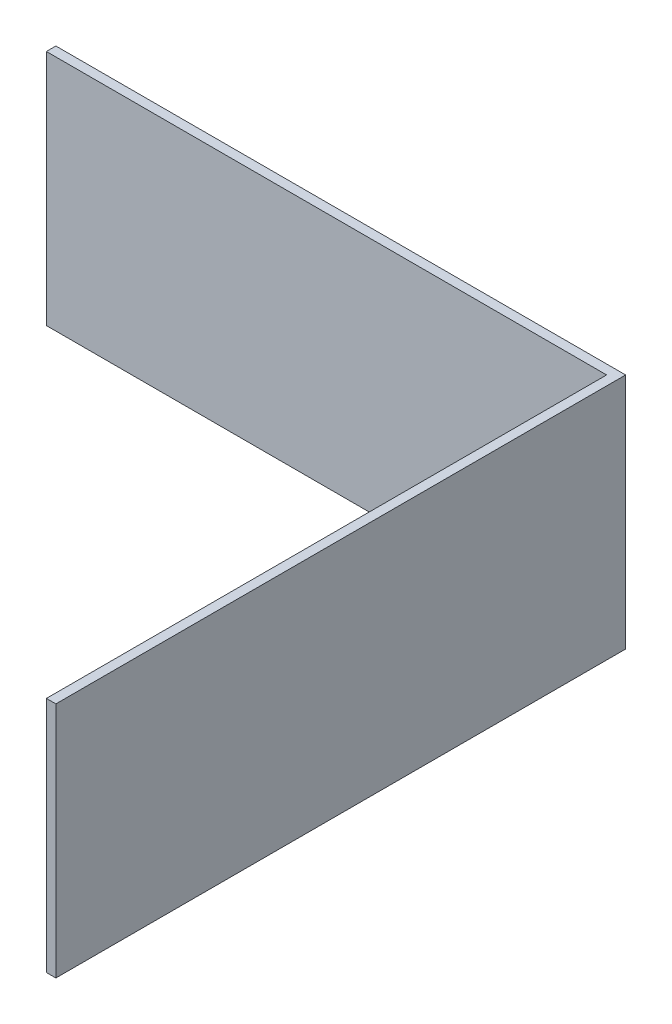
ISO-10303-21;
HEADER;
FILE_DESCRIPTION(('STEP AP214'),'2;1');
FILE_NAME('part.step','',(''),(''),'','','');
FILE_SCHEMA(('AUTOMOTIVE_DESIGN { 1 0 10303 214 1 1 1 1 }'));
ENDSEC;
DATA;
#1=APPLICATION_CONTEXT('core data for automotive mechanical design processes');
#2=APPLICATION_PROTOCOL_DEFINITION('international standard','automotive_design',2000,#1);
#3=PRODUCT_CONTEXT('',#1,'mechanical');
#4=PRODUCT('Part','Part','',(#3));
#5=PRODUCT_RELATED_PRODUCT_CATEGORY('part','',(#4));
#6=PRODUCT_DEFINITION_FORMATION('','',#4);
#7=PRODUCT_DEFINITION_CONTEXT('part definition',#1,'design');
#8=PRODUCT_DEFINITION('design','',#6,#7);
#9=PRODUCT_DEFINITION_SHAPE('','',#8);
#10=(LENGTH_UNIT() NAMED_UNIT(*) SI_UNIT(.MILLI.,.METRE.));
#11=(NAMED_UNIT(*) PLANE_ANGLE_UNIT() SI_UNIT($,.RADIAN.));
#12=(NAMED_UNIT(*) SI_UNIT($,.STERADIAN.) SOLID_ANGLE_UNIT());
#13=UNCERTAINTY_MEASURE_WITH_UNIT(LENGTH_MEASURE(1.E-05),#10,'distance_accuracy_value','');
#14=(GEOMETRIC_REPRESENTATION_CONTEXT(3) GLOBAL_UNCERTAINTY_ASSIGNED_CONTEXT((#13)) GLOBAL_UNIT_ASSIGNED_CONTEXT((#10,
#11,#12)) REPRESENTATION_CONTEXT('',''));
#15=CARTESIAN_POINT('',(0.,0.,0.));
#16=DIRECTION('',(0.,0.,1.));
#17=DIRECTION('',(1.,0.,0.));
#18=AXIS2_PLACEMENT_3D('',#15,#16,#17);
#19=CARTESIAN_POINT('',(3000.,2520.,3000.));
#20=DIRECTION('',(-1.,0.,0.));
#21=DIRECTION('',(0.,0.,1.));
#22=AXIS2_PLACEMENT_3D('',#19,#20,#21);
#23=PLANE('',#22);
#24=DIRECTION('',(0.,0.,-1.));
#25=VECTOR('',#24,1.);
#26=CARTESIAN_POINT('',(3000.,20.,3000.));
#27=LINE('',#26,#25);
#28=CARTESIAN_POINT('',(3000.,20.,3000.));
#29=VERTEX_POINT('',#28);
#30=CARTESIAN_POINT('',(3000.,20.,-3000.));
#31=VERTEX_POINT('',#30);
#32=EDGE_CURVE('E118',#29,#31,#27,.T.);
#33=ORIENTED_EDGE('',*,*,#32,.T.);
#34=DIRECTION('',(0.,-1.,0.));
#35=VECTOR('',#34,1.);
#36=CARTESIAN_POINT('',(3000.,2520.,-3000.));
#37=LINE('',#36,#35);
#38=CARTESIAN_POINT('',(3000.,2520.,-3000.));
#39=VERTEX_POINT('',#38);
#40=EDGE_CURVE('E11',#39,#31,#37,.T.);
#41=ORIENTED_EDGE('',*,*,#40,.F.);
#42=DIRECTION('',(0.,0.,-1.));
#43=VECTOR('',#42,1.);
#44=CARTESIAN_POINT('',(3000.,2520.,3000.));
#45=LINE('',#44,#43);
#46=CARTESIAN_POINT('',(3000.,2520.,3000.));
#47=VERTEX_POINT('',#46);
#48=EDGE_CURVE('E128',#47,#39,#45,.T.);
#49=ORIENTED_EDGE('',*,*,#48,.F.);
#50=DIRECTION('',(0.,-1.,0.));
#51=VECTOR('',#50,1.);
#52=CARTESIAN_POINT('',(3000.,2520.,3000.));
#53=LINE('',#52,#51);
#54=EDGE_CURVE('E114',#47,#29,#53,.T.);
#55=ORIENTED_EDGE('',*,*,#54,.T.);
#56=EDGE_LOOP('',(#33,#41,#49,#55));
#57=FACE_BOUND('',#56,.T.);
#58=ADVANCED_FACE('F34',(#57),#23,.F.);
#59=CARTESIAN_POINT('',(3000.,2520.,-3000.));
#60=DIRECTION('',(0.,0.,1.));
#61=DIRECTION('',(1.,0.,0.));
#62=AXIS2_PLACEMENT_3D('',#59,#60,#61);
#63=PLANE('',#62);
#64=DIRECTION('',(-1.,0.,0.));
#65=VECTOR('',#64,1.);
#66=CARTESIAN_POINT('',(3000.,20.,-3000.));
#67=LINE('',#66,#65);
#68=CARTESIAN_POINT('',(-3000.,20.,-3000.));
#69=VERTEX_POINT('',#68);
#70=EDGE_CURVE('E121',#31,#69,#67,.T.);
#71=ORIENTED_EDGE('',*,*,#70,.T.);
#72=DIRECTION('',(0.,-1.,0.));
#73=VECTOR('',#72,1.);
#74=CARTESIAN_POINT('',(-3000.,2520.,-3000.));
#75=LINE('',#74,#73);
#76=CARTESIAN_POINT('',(-3000.,2520.,-3000.));
#77=VERTEX_POINT('',#76);
#78=EDGE_CURVE('E42',#77,#69,#75,.T.);
#79=ORIENTED_EDGE('',*,*,#78,.F.);
#80=DIRECTION('',(-1.,0.,0.));
#81=VECTOR('',#80,1.);
#82=CARTESIAN_POINT('',(3000.,2520.,-3000.));
#83=LINE('',#82,#81);
#84=EDGE_CURVE('E87',#39,#77,#83,.T.);
#85=ORIENTED_EDGE('',*,*,#84,.F.);
#86=ORIENTED_EDGE('',*,*,#40,.T.);
#87=EDGE_LOOP('',(#71,#79,#85,#86));
#88=FACE_BOUND('',#87,.T.);
#89=ADVANCED_FACE('F152',(#88),#63,.F.);
#90=CARTESIAN_POINT('',(-3000.,2520.,-3000.));
#91=DIRECTION('',(1.,0.,0.));
#92=DIRECTION('',(0.,0.,-1.));
#93=AXIS2_PLACEMENT_3D('',#90,#91,#92);
#94=PLANE('',#93);
#95=DIRECTION('',(0.,0.,1.));
#96=VECTOR('',#95,1.);
#97=CARTESIAN_POINT('',(-3000.,20.,-3000.));
#98=LINE('',#97,#96);
#99=CARTESIAN_POINT('',(-3000.,20.,-2900.));
#100=VERTEX_POINT('',#99);
#101=EDGE_CURVE('E123',#69,#100,#98,.T.);
#102=ORIENTED_EDGE('',*,*,#101,.T.);
#103=DIRECTION('',(0.,-1.,0.));
#104=VECTOR('',#103,1.);
#105=CARTESIAN_POINT('',(-3000.,2520.,-2900.));
#106=LINE('',#105,#104);
#107=CARTESIAN_POINT('',(-3000.,2520.,-2900.));
#108=VERTEX_POINT('',#107);
#109=EDGE_CURVE('E109',#108,#100,#106,.T.);
#110=ORIENTED_EDGE('',*,*,#109,.F.);
#111=DIRECTION('',(0.,0.,1.));
#112=VECTOR('',#111,1.);
#113=CARTESIAN_POINT('',(-3000.,2520.,-3000.));
#114=LINE('',#113,#112);
#115=EDGE_CURVE('E100',#77,#108,#114,.T.);
#116=ORIENTED_EDGE('',*,*,#115,.F.);
#117=ORIENTED_EDGE('',*,*,#78,.T.);
#118=EDGE_LOOP('',(#102,#110,#116,#117));
#119=FACE_BOUND('',#118,.T.);
#120=ADVANCED_FACE('F134',(#119),#94,.F.);
#121=CARTESIAN_POINT('',(-3000.,2520.,-2900.));
#122=DIRECTION('',(0.,0.,-1.));
#123=DIRECTION('',(-1.,0.,0.));
#124=AXIS2_PLACEMENT_3D('',#121,#122,#123);
#125=PLANE('',#124);
#126=DIRECTION('',(1.,0.,0.));
#127=VECTOR('',#126,1.);
#128=CARTESIAN_POINT('',(-3000.,20.,-2900.));
#129=LINE('',#128,#127);
#130=CARTESIAN_POINT('',(2900.,20.,-2900.));
#131=VERTEX_POINT('',#130);
#132=EDGE_CURVE('E108',#100,#131,#129,.T.);
#133=ORIENTED_EDGE('',*,*,#132,.T.);
#134=DIRECTION('',(0.,-1.,0.));
#135=VECTOR('',#134,1.);
#136=CARTESIAN_POINT('',(2900.,2520.,-2900.));
#137=LINE('',#136,#135);
#138=CARTESIAN_POINT('',(2900.,2520.,-2900.));
#139=VERTEX_POINT('',#138);
#140=EDGE_CURVE('E105',#139,#131,#137,.T.);
#141=ORIENTED_EDGE('',*,*,#140,.F.);
#142=DIRECTION('',(1.,0.,0.));
#143=VECTOR('',#142,1.);
#144=CARTESIAN_POINT('',(-3000.,2520.,-2900.));
#145=LINE('',#144,#143);
#146=EDGE_CURVE('E94',#108,#139,#145,.T.);
#147=ORIENTED_EDGE('',*,*,#146,.F.);
#148=ORIENTED_EDGE('',*,*,#109,.T.);
#149=EDGE_LOOP('',(#133,#141,#147,#148));
#150=FACE_BOUND('',#149,.T.);
#151=ADVANCED_FACE('F106',(#150),#125,.F.);
#152=CARTESIAN_POINT('',(2900.,2520.,-2900.));
#153=DIRECTION('',(1.,0.,0.));
#154=DIRECTION('',(0.,0.,-1.));
#155=AXIS2_PLACEMENT_3D('',#152,#153,#154);
#156=PLANE('',#155);
#157=DIRECTION('',(0.,0.,1.));
#158=VECTOR('',#157,1.);
#159=CARTESIAN_POINT('',(2900.,20.,-2900.));
#160=LINE('',#159,#158);
#161=CARTESIAN_POINT('',(2900.,20.,3000.));
#162=VERTEX_POINT('',#161);
#163=EDGE_CURVE('E73',#131,#162,#160,.T.);
#164=ORIENTED_EDGE('',*,*,#163,.T.);
#165=DIRECTION('',(0.,-1.,0.));
#166=VECTOR('',#165,1.);
#167=CARTESIAN_POINT('',(2900.,2520.,3000.));
#168=LINE('',#167,#166);
#169=CARTESIAN_POINT('',(2900.,2520.,3000.));
#170=VERTEX_POINT('',#169);
#171=EDGE_CURVE('E110',#170,#162,#168,.T.);
#172=ORIENTED_EDGE('',*,*,#171,.F.);
#173=DIRECTION('',(0.,0.,1.));
#174=VECTOR('',#173,1.);
#175=CARTESIAN_POINT('',(2900.,2520.,-2900.));
#176=LINE('',#175,#174);
#177=EDGE_CURVE('E98',#139,#170,#176,.T.);
#178=ORIENTED_EDGE('',*,*,#177,.F.);
#179=ORIENTED_EDGE('',*,*,#140,.T.);
#180=EDGE_LOOP('',(#164,#172,#178,#179));
#181=FACE_BOUND('',#180,.T.);
#182=ADVANCED_FACE('F112',(#181),#156,.F.);
#183=CARTESIAN_POINT('',(3000.,2520.,3000.));
#184=DIRECTION('',(0.,0.,-1.));
#185=DIRECTION('',(-1.,0.,0.));
#186=AXIS2_PLACEMENT_3D('',#183,#184,#185);
#187=PLANE('',#186);
#188=DIRECTION('',(1.,0.,0.));
#189=VECTOR('',#188,1.);
#190=CARTESIAN_POINT('',(3000.,20.,3000.));
#191=LINE('',#190,#189);
#192=EDGE_CURVE('E79',#162,#29,#191,.T.);
#193=ORIENTED_EDGE('',*,*,#192,.T.);
#194=ORIENTED_EDGE('',*,*,#54,.F.);
#195=DIRECTION('',(1.,0.,0.));
#196=VECTOR('',#195,1.);
#197=CARTESIAN_POINT('',(3000.,2520.,3000.));
#198=LINE('',#197,#196);
#199=EDGE_CURVE('E50',#170,#47,#198,.T.);
#200=ORIENTED_EDGE('',*,*,#199,.F.);
#201=ORIENTED_EDGE('',*,*,#171,.T.);
#202=EDGE_LOOP('',(#193,#194,#200,#201));
#203=FACE_BOUND('',#202,.T.);
#204=ADVANCED_FACE('F141',(#203),#187,.F.);
#205=CARTESIAN_POINT('',(3000.,2520.,-3000.));
#206=DIRECTION('',(0.,1.,0.));
#207=DIRECTION('',(0.,0.,1.));
#208=AXIS2_PLACEMENT_3D('',#205,#206,#207);
#209=PLANE('',#208);
#210=ORIENTED_EDGE('',*,*,#48,.T.);
#211=ORIENTED_EDGE('',*,*,#84,.T.);
#212=ORIENTED_EDGE('',*,*,#115,.T.);
#213=ORIENTED_EDGE('',*,*,#146,.T.);
#214=ORIENTED_EDGE('',*,*,#177,.T.);
#215=ORIENTED_EDGE('',*,*,#199,.T.);
#216=EDGE_LOOP('',(#210,#211,#212,#213,#214,#215));
#217=FACE_BOUND('',#216,.T.);
#218=ADVANCED_FACE('F96',(#217),#209,.T.);
#219=CARTESIAN_POINT('',(3000.,20.,-3000.));
#220=DIRECTION('',(0.,1.,0.));
#221=DIRECTION('',(0.,0.,1.));
#222=AXIS2_PLACEMENT_3D('',#219,#220,#221);
#223=PLANE('',#222);
#224=ORIENTED_EDGE('',*,*,#32,.F.);
#225=ORIENTED_EDGE('',*,*,#192,.F.);
#226=ORIENTED_EDGE('',*,*,#163,.F.);
#227=ORIENTED_EDGE('',*,*,#132,.F.);
#228=ORIENTED_EDGE('',*,*,#101,.F.);
#229=ORIENTED_EDGE('',*,*,#70,.F.);
#230=EDGE_LOOP('',(#224,#225,#226,#227,#228,#229));
#231=FACE_BOUND('',#230,.T.);
#232=ADVANCED_FACE('F137',(#231),#223,.F.);
#233=CLOSED_SHELL('',(#58,#89,#120,#151,#182,#204,#218,#232));
#234=MANIFOLD_SOLID_BREP('B2',#233);
#235=ADVANCED_BREP_SHAPE_REPRESENTATION('',(#18,#234),#14);
#236=SHAPE_DEFINITION_REPRESENTATION(#9,#235);
ENDSEC;
END-ISO-10303-21;
